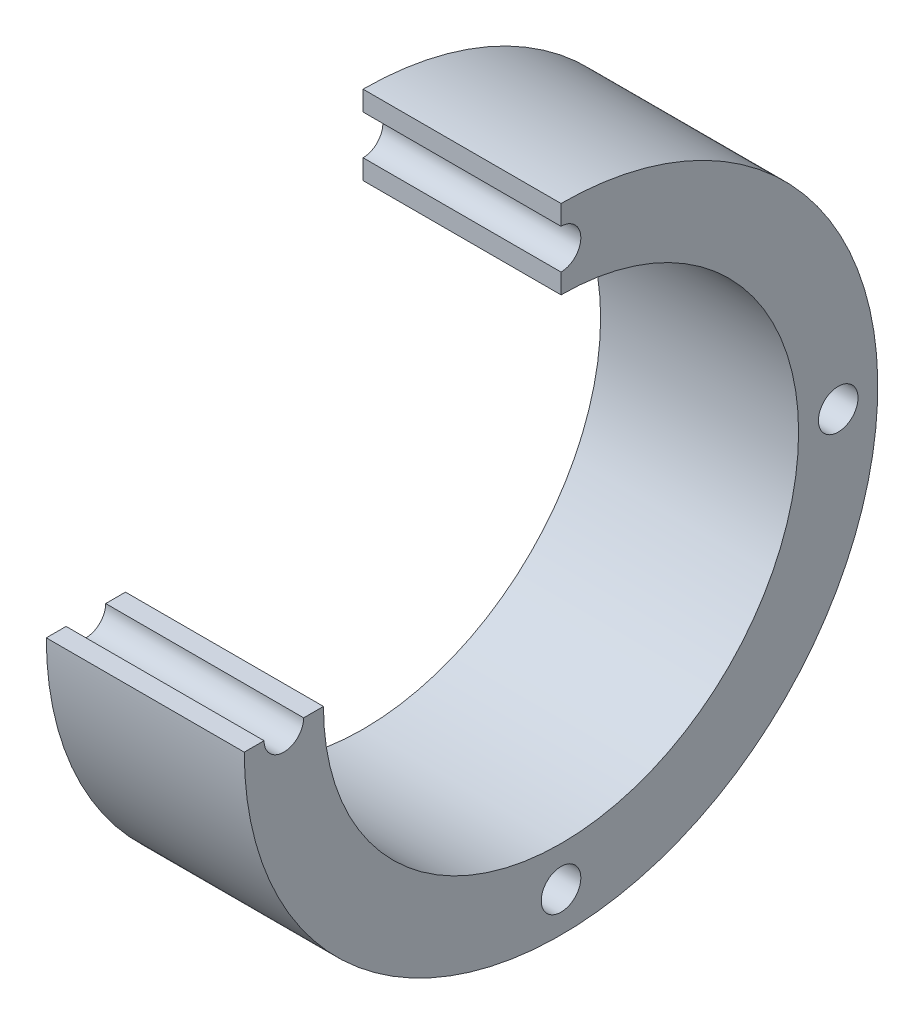
ISO-10303-21;
HEADER;
FILE_DESCRIPTION(('STEP AP214'),'2;1');
FILE_NAME('part.step','',(''),(''),'','','');
FILE_SCHEMA(('AUTOMOTIVE_DESIGN { 1 0 10303 214 1 1 1 1 }'));
ENDSEC;
DATA;
#1=APPLICATION_CONTEXT('core data for automotive mechanical design processes');
#2=APPLICATION_PROTOCOL_DEFINITION('international standard','automotive_design',2000,#1);
#3=PRODUCT_CONTEXT('',#1,'mechanical');
#4=PRODUCT('Part','Part','',(#3));
#5=PRODUCT_RELATED_PRODUCT_CATEGORY('part','',(#4));
#6=PRODUCT_DEFINITION_FORMATION('','',#4);
#7=PRODUCT_DEFINITION_CONTEXT('part definition',#1,'design');
#8=PRODUCT_DEFINITION('design','',#6,#7);
#9=PRODUCT_DEFINITION_SHAPE('','',#8);
#10=(LENGTH_UNIT() NAMED_UNIT(*) SI_UNIT(.MILLI.,.METRE.));
#11=(NAMED_UNIT(*) PLANE_ANGLE_UNIT() SI_UNIT($,.RADIAN.));
#12=(NAMED_UNIT(*) SI_UNIT($,.STERADIAN.) SOLID_ANGLE_UNIT());
#13=UNCERTAINTY_MEASURE_WITH_UNIT(LENGTH_MEASURE(1.E-05),#10,'distance_accuracy_value','');
#14=(GEOMETRIC_REPRESENTATION_CONTEXT(3) GLOBAL_UNCERTAINTY_ASSIGNED_CONTEXT((#13)) GLOBAL_UNIT_ASSIGNED_CONTEXT((#10,
#11,#12)) REPRESENTATION_CONTEXT('',''));
#15=CARTESIAN_POINT('',(0.,0.,0.));
#16=DIRECTION('',(0.,0.,1.));
#17=DIRECTION('',(1.,0.,0.));
#18=AXIS2_PLACEMENT_3D('',#15,#16,#17);
#19=CARTESIAN_POINT('',(25.,0.,0.));
#20=DIRECTION('',(1.,0.,0.));
#21=DIRECTION('',(0.,0.,-1.));
#22=AXIS2_PLACEMENT_3D('',#19,#20,#21);
#23=PLANE('',#22);
#24=DIRECTION('',(0.,0.,-1.));
#25=VECTOR('',#24,1.);
#26=CARTESIAN_POINT('',(25.,0.,93.474358870609));
#27=LINE('',#26,#25);
#28=CARTESIAN_POINT('',(25.,0.,80.));
#29=VERTEX_POINT('',#28);
#30=CARTESIAN_POINT('',(25.,0.,75.));
#31=VERTEX_POINT('',#30);
#32=EDGE_CURVE('E57',#29,#31,#27,.T.);
#33=ORIENTED_EDGE('',*,*,#32,.F.);
#34=CARTESIAN_POINT('',(25.,0.,0.));
#35=DIRECTION('',(1.,0.,0.));
#36=DIRECTION('',(0.,0.,-1.));
#37=AXIS2_PLACEMENT_3D('',#34,#35,#36);
#38=CIRCLE('',#37,80.);
#39=CARTESIAN_POINT('',(25.,80.,0.));
#40=VERTEX_POINT('',#39);
#41=EDGE_CURVE('E116',#29,#40,#38,.T.);
#42=ORIENTED_EDGE('',*,*,#41,.T.);
#43=DIRECTION('',(0.,1.,0.));
#44=VECTOR('',#43,1.);
#45=CARTESIAN_POINT('',(25.,0.,0.));
#46=LINE('',#45,#44);
#47=CARTESIAN_POINT('',(25.,75.,0.));
#48=VERTEX_POINT('',#47);
#49=EDGE_CURVE('E125',#48,#40,#46,.T.);
#50=ORIENTED_EDGE('',*,*,#49,.F.);
#51=CARTESIAN_POINT('',(25.,70.,0.));
#52=DIRECTION('',(1.,0.,0.));
#53=DIRECTION('',(0.,0.,1.));
#54=AXIS2_PLACEMENT_3D('',#51,#52,#53);
#55=CIRCLE('',#54,5.);
#56=CARTESIAN_POINT('',(25.,65.,0.));
#57=VERTEX_POINT('',#56);
#58=EDGE_CURVE('E172',#57,#48,#55,.T.);
#59=ORIENTED_EDGE('',*,*,#58,.F.);
#60=CARTESIAN_POINT('',(25.,60.,0.));
#61=VERTEX_POINT('',#60);
#62=EDGE_CURVE('E152',#61,#57,#46,.T.);
#63=ORIENTED_EDGE('',*,*,#62,.F.);
#64=CARTESIAN_POINT('',(25.,0.,0.));
#65=DIRECTION('',(1.,0.,0.));
#66=DIRECTION('',(0.,0.,-1.));
#67=AXIS2_PLACEMENT_3D('',#64,#65,#66);
#68=CIRCLE('',#67,60.);
#69=CARTESIAN_POINT('',(25.,0.,60.));
#70=VERTEX_POINT('',#69);
#71=EDGE_CURVE('E134',#70,#61,#68,.T.);
#72=ORIENTED_EDGE('',*,*,#71,.F.);
#73=CARTESIAN_POINT('',(25.,0.,65.));
#74=VERTEX_POINT('',#73);
#75=EDGE_CURVE('E122',#74,#70,#27,.T.);
#76=ORIENTED_EDGE('',*,*,#75,.F.);
#77=CARTESIAN_POINT('',(25.,-7.33211081157058E-13,70.));
#78=DIRECTION('',(1.,0.,0.));
#79=DIRECTION('',(0.,-1.,0.));
#80=AXIS2_PLACEMENT_3D('',#77,#78,#79);
#81=CIRCLE('',#80,5.);
#82=EDGE_CURVE('E112',#31,#74,#81,.T.);
#83=ORIENTED_EDGE('',*,*,#82,.F.);
#84=EDGE_LOOP('',(#33,#42,#50,#59,#63,#72,#76,#83));
#85=FACE_BOUND('',#84,.T.);
#86=CARTESIAN_POINT('',(25.,2.44403693719019E-13,-70.));
#87=DIRECTION('',(1.,0.,0.));
#88=DIRECTION('',(0.,1.,0.));
#89=AXIS2_PLACEMENT_3D('',#86,#87,#88);
#90=CIRCLE('',#89,5.);
#91=CARTESIAN_POINT('',(25.,5.00000000000025,-70.));
#92=VERTEX_POINT('',#91);
#93=EDGE_CURVE('E164',#92,#92,#90,.T.);
#94=ORIENTED_EDGE('',*,*,#93,.F.);
#95=EDGE_LOOP('',(#94));
#96=FACE_BOUND('',#95,.T.);
#97=CARTESIAN_POINT('',(25.,-70.,0.));
#98=DIRECTION('',(1.,0.,0.));
#99=DIRECTION('',(0.,0.,-1.));
#100=AXIS2_PLACEMENT_3D('',#97,#98,#99);
#101=CIRCLE('',#100,5.);
#102=CARTESIAN_POINT('',(25.,-70.,-5.));
#103=VERTEX_POINT('',#102);
#104=EDGE_CURVE('E163',#103,#103,#101,.T.);
#105=ORIENTED_EDGE('',*,*,#104,.F.);
#106=EDGE_LOOP('',(#105));
#107=FACE_BOUND('',#106,.T.);
#108=ADVANCED_FACE('F41',(#85,#96,#107),#23,.T.);
#109=CARTESIAN_POINT('',(-25.,0.,0.));
#110=DIRECTION('',(1.,0.,0.));
#111=DIRECTION('',(0.,0.,-1.));
#112=AXIS2_PLACEMENT_3D('',#109,#110,#111);
#113=PLANE('',#112);
#114=CARTESIAN_POINT('',(-25.,2.44403693719019E-13,-70.));
#115=DIRECTION('',(1.,0.,0.));
#116=DIRECTION('',(0.,1.,0.));
#117=AXIS2_PLACEMENT_3D('',#114,#115,#116);
#118=CIRCLE('',#117,5.);
#119=CARTESIAN_POINT('',(-25.,5.00000000000025,-70.));
#120=VERTEX_POINT('',#119);
#121=EDGE_CURVE('E161',#120,#120,#118,.T.);
#122=ORIENTED_EDGE('',*,*,#121,.T.);
#123=EDGE_LOOP('',(#122));
#124=FACE_BOUND('',#123,.T.);
#125=CARTESIAN_POINT('',(-25.,0.,0.));
#126=DIRECTION('',(1.,0.,0.));
#127=DIRECTION('',(0.,0.,-1.));
#128=AXIS2_PLACEMENT_3D('',#125,#126,#127);
#129=CIRCLE('',#128,60.);
#130=CARTESIAN_POINT('',(-25.,0.,60.));
#131=VERTEX_POINT('',#130);
#132=CARTESIAN_POINT('',(-25.,60.,0.));
#133=VERTEX_POINT('',#132);
#134=EDGE_CURVE('E136',#131,#133,#129,.T.);
#135=ORIENTED_EDGE('',*,*,#134,.T.);
#136=DIRECTION('',(0.,1.,0.));
#137=VECTOR('',#136,1.);
#138=CARTESIAN_POINT('',(-25.,0.,0.));
#139=LINE('',#138,#137);
#140=CARTESIAN_POINT('',(-25.,65.,0.));
#141=VERTEX_POINT('',#140);
#142=EDGE_CURVE('E155',#133,#141,#139,.T.);
#143=ORIENTED_EDGE('',*,*,#142,.T.);
#144=CARTESIAN_POINT('',(-25.,70.,0.));
#145=DIRECTION('',(1.,0.,0.));
#146=DIRECTION('',(0.,0.,1.));
#147=AXIS2_PLACEMENT_3D('',#144,#145,#146);
#148=CIRCLE('',#147,5.);
#149=CARTESIAN_POINT('',(-25.,75.,0.));
#150=VERTEX_POINT('',#149);
#151=EDGE_CURVE('E169',#141,#150,#148,.T.);
#152=ORIENTED_EDGE('',*,*,#151,.T.);
#153=CARTESIAN_POINT('',(-25.,80.,0.));
#154=VERTEX_POINT('',#153);
#155=EDGE_CURVE('E147',#150,#154,#139,.T.);
#156=ORIENTED_EDGE('',*,*,#155,.T.);
#157=CARTESIAN_POINT('',(-25.,0.,0.));
#158=DIRECTION('',(1.,0.,0.));
#159=DIRECTION('',(0.,0.,-1.));
#160=AXIS2_PLACEMENT_3D('',#157,#158,#159);
#161=CIRCLE('',#160,80.);
#162=CARTESIAN_POINT('',(-25.,0.,80.));
#163=VERTEX_POINT('',#162);
#164=EDGE_CURVE('E126',#163,#154,#161,.T.);
#165=ORIENTED_EDGE('',*,*,#164,.F.);
#166=DIRECTION('',(0.,0.,-1.));
#167=VECTOR('',#166,1.);
#168=CARTESIAN_POINT('',(-25.,0.,93.474358870609));
#169=LINE('',#168,#167);
#170=CARTESIAN_POINT('',(-25.,0.,75.));
#171=VERTEX_POINT('',#170);
#172=EDGE_CURVE('E106',#163,#171,#169,.T.);
#173=ORIENTED_EDGE('',*,*,#172,.T.);
#174=CARTESIAN_POINT('',(-25.,-7.33211081157058E-13,70.));
#175=DIRECTION('',(1.,0.,0.));
#176=DIRECTION('',(0.,-1.,0.));
#177=AXIS2_PLACEMENT_3D('',#174,#175,#176);
#178=CIRCLE('',#177,5.);
#179=CARTESIAN_POINT('',(-25.,-7.33211081157058E-13,65.));
#180=VERTEX_POINT('',#179);
#181=EDGE_CURVE('E145',#171,#180,#178,.T.);
#182=ORIENTED_EDGE('',*,*,#181,.T.);
#183=EDGE_CURVE('E61',#180,#131,#169,.T.);
#184=ORIENTED_EDGE('',*,*,#183,.T.);
#185=EDGE_LOOP('',(#135,#143,#152,#156,#165,#173,#182,#184));
#186=FACE_BOUND('',#185,.T.);
#187=CARTESIAN_POINT('',(-25.,-70.,0.));
#188=DIRECTION('',(1.,0.,0.));
#189=DIRECTION('',(0.,0.,-1.));
#190=AXIS2_PLACEMENT_3D('',#187,#188,#189);
#191=CIRCLE('',#190,5.);
#192=CARTESIAN_POINT('',(-25.,-70.,-5.));
#193=VERTEX_POINT('',#192);
#194=EDGE_CURVE('E176',#193,#193,#191,.T.);
#195=ORIENTED_EDGE('',*,*,#194,.T.);
#196=EDGE_LOOP('',(#195));
#197=FACE_BOUND('',#196,.T.);
#198=ADVANCED_FACE('F150',(#124,#186,#197),#113,.F.);
#199=CARTESIAN_POINT('',(25.,0.,0.));
#200=DIRECTION('',(-1.,0.,0.));
#201=DIRECTION('',(0.,0.,1.));
#202=AXIS2_PLACEMENT_3D('',#199,#200,#201);
#203=CYLINDRICAL_SURFACE('',#202,80.);
#204=ORIENTED_EDGE('',*,*,#164,.T.);
#205=DIRECTION('',(-1.,0.,0.));
#206=VECTOR('',#205,1.);
#207=CARTESIAN_POINT('',(25.,80.,0.));
#208=LINE('',#207,#206);
#209=EDGE_CURVE('E127',#154,#40,#208,.F.);
#210=ORIENTED_EDGE('',*,*,#209,.T.);
#211=ORIENTED_EDGE('',*,*,#41,.F.);
#212=DIRECTION('',(-1.,0.,0.));
#213=VECTOR('',#212,1.);
#214=CARTESIAN_POINT('',(25.,0.,80.));
#215=LINE('',#214,#213);
#216=EDGE_CURVE('E103',#29,#163,#215,.T.);
#217=ORIENTED_EDGE('',*,*,#216,.T.);
#218=EDGE_LOOP('',(#204,#210,#211,#217));
#219=FACE_BOUND('',#218,.T.);
#220=ADVANCED_FACE('F43',(#219),#203,.T.);
#221=CARTESIAN_POINT('',(25.,0.,0.));
#222=DIRECTION('',(-1.,0.,0.));
#223=DIRECTION('',(0.,0.,1.));
#224=AXIS2_PLACEMENT_3D('',#221,#222,#223);
#225=CYLINDRICAL_SURFACE('',#224,60.);
#226=DIRECTION('',(-1.,0.,0.));
#227=VECTOR('',#226,1.);
#228=CARTESIAN_POINT('',(25.,60.,0.));
#229=LINE('',#228,#227);
#230=EDGE_CURVE('E160',#133,#61,#229,.F.);
#231=ORIENTED_EDGE('',*,*,#230,.F.);
#232=ORIENTED_EDGE('',*,*,#134,.F.);
#233=DIRECTION('',(-1.,0.,0.));
#234=VECTOR('',#233,1.);
#235=CARTESIAN_POINT('',(25.,0.,60.));
#236=LINE('',#235,#234);
#237=EDGE_CURVE('E115',#70,#131,#236,.T.);
#238=ORIENTED_EDGE('',*,*,#237,.F.);
#239=ORIENTED_EDGE('',*,*,#71,.T.);
#240=EDGE_LOOP('',(#231,#232,#238,#239));
#241=FACE_BOUND('',#240,.T.);
#242=ADVANCED_FACE('F189',(#241),#225,.F.);
#243=CARTESIAN_POINT('',(-25.,-70.,0.));
#244=DIRECTION('',(1.,0.,0.));
#245=DIRECTION('',(0.,0.,-1.));
#246=AXIS2_PLACEMENT_3D('',#243,#244,#245);
#247=CYLINDRICAL_SURFACE('',#246,5.);
#248=ORIENTED_EDGE('',*,*,#194,.F.);
#249=EDGE_LOOP('',(#248));
#250=FACE_BOUND('',#249,.T.);
#251=ORIENTED_EDGE('',*,*,#104,.T.);
#252=EDGE_LOOP('',(#251));
#253=FACE_BOUND('',#252,.T.);
#254=ADVANCED_FACE('F216',(#250,#253),#247,.F.);
#255=CARTESIAN_POINT('',(-25.,-7.33211081157058E-13,70.));
#256=DIRECTION('',(1.,0.,0.));
#257=DIRECTION('',(0.,0.,-1.));
#258=AXIS2_PLACEMENT_3D('',#255,#256,#257);
#259=CYLINDRICAL_SURFACE('',#258,5.);
#260=ORIENTED_EDGE('',*,*,#82,.T.);
#261=DIRECTION('',(1.,0.,0.));
#262=VECTOR('',#261,1.);
#263=CARTESIAN_POINT('',(-25.,0.,65.));
#264=LINE('',#263,#262);
#265=EDGE_CURVE('E11',#74,#180,#264,.F.);
#266=ORIENTED_EDGE('',*,*,#265,.T.);
#267=ORIENTED_EDGE('',*,*,#181,.F.);
#268=DIRECTION('',(1.,0.,0.));
#269=VECTOR('',#268,1.);
#270=CARTESIAN_POINT('',(-25.,0.,75.));
#271=LINE('',#270,#269);
#272=EDGE_CURVE('E47',#171,#31,#271,.T.);
#273=ORIENTED_EDGE('',*,*,#272,.T.);
#274=EDGE_LOOP('',(#260,#266,#267,#273));
#275=FACE_BOUND('',#274,.T.);
#276=ADVANCED_FACE('F142',(#275),#259,.F.);
#277=CARTESIAN_POINT('',(-25.,70.,0.));
#278=DIRECTION('',(1.,0.,0.));
#279=DIRECTION('',(0.,0.,-1.));
#280=AXIS2_PLACEMENT_3D('',#277,#278,#279);
#281=CYLINDRICAL_SURFACE('',#280,5.);
#282=ORIENTED_EDGE('',*,*,#58,.T.);
#283=DIRECTION('',(1.,0.,0.));
#284=VECTOR('',#283,1.);
#285=CARTESIAN_POINT('',(-25.,75.,0.));
#286=LINE('',#285,#284);
#287=EDGE_CURVE('E132',#48,#150,#286,.F.);
#288=ORIENTED_EDGE('',*,*,#287,.T.);
#289=ORIENTED_EDGE('',*,*,#151,.F.);
#290=DIRECTION('',(1.,0.,0.));
#291=VECTOR('',#290,1.);
#292=CARTESIAN_POINT('',(-25.,65.,0.));
#293=LINE('',#292,#291);
#294=EDGE_CURVE('E130',#141,#57,#293,.T.);
#295=ORIENTED_EDGE('',*,*,#294,.T.);
#296=EDGE_LOOP('',(#282,#288,#289,#295));
#297=FACE_BOUND('',#296,.T.);
#298=ADVANCED_FACE('F193',(#297),#281,.F.);
#299=CARTESIAN_POINT('',(-25.,2.44403693719019E-13,-70.));
#300=DIRECTION('',(1.,0.,0.));
#301=DIRECTION('',(0.,0.,-1.));
#302=AXIS2_PLACEMENT_3D('',#299,#300,#301);
#303=CYLINDRICAL_SURFACE('',#302,5.);
#304=ORIENTED_EDGE('',*,*,#121,.F.);
#305=EDGE_LOOP('',(#304));
#306=FACE_BOUND('',#305,.T.);
#307=ORIENTED_EDGE('',*,*,#93,.T.);
#308=EDGE_LOOP('',(#307));
#309=FACE_BOUND('',#308,.T.);
#310=ADVANCED_FACE('F202',(#306,#309),#303,.F.);
#311=CARTESIAN_POINT('',(-25.,0.,0.));
#312=DIRECTION('',(0.,0.,-1.));
#313=DIRECTION('',(-1.,0.,0.));
#314=AXIS2_PLACEMENT_3D('',#311,#312,#313);
#315=PLANE('',#314);
#316=ORIENTED_EDGE('',*,*,#230,.T.);
#317=ORIENTED_EDGE('',*,*,#62,.T.);
#318=ORIENTED_EDGE('',*,*,#294,.F.);
#319=ORIENTED_EDGE('',*,*,#142,.F.);
#320=EDGE_LOOP('',(#316,#317,#318,#319));
#321=FACE_BOUND('',#320,.T.);
#322=ADVANCED_FACE('F191',(#321),#315,.F.);
#323=ORIENTED_EDGE('',*,*,#155,.F.);
#324=ORIENTED_EDGE('',*,*,#287,.F.);
#325=ORIENTED_EDGE('',*,*,#49,.T.);
#326=ORIENTED_EDGE('',*,*,#209,.F.);
#327=EDGE_LOOP('',(#323,#324,#325,#326));
#328=FACE_BOUND('',#327,.T.);
#329=ADVANCED_FACE('F198',(#328),#315,.F.);
#330=CARTESIAN_POINT('',(-25.,0.,93.474358870609));
#331=DIRECTION('',(0.,-1.,0.));
#332=DIRECTION('',(0.,0.,-1.));
#333=AXIS2_PLACEMENT_3D('',#330,#331,#332);
#334=PLANE('',#333);
#335=ORIENTED_EDGE('',*,*,#32,.T.);
#336=ORIENTED_EDGE('',*,*,#272,.F.);
#337=ORIENTED_EDGE('',*,*,#172,.F.);
#338=ORIENTED_EDGE('',*,*,#216,.F.);
#339=EDGE_LOOP('',(#335,#336,#337,#338));
#340=FACE_BOUND('',#339,.T.);
#341=ADVANCED_FACE('F102',(#340),#334,.F.);
#342=ORIENTED_EDGE('',*,*,#237,.T.);
#343=ORIENTED_EDGE('',*,*,#183,.F.);
#344=ORIENTED_EDGE('',*,*,#265,.F.);
#345=ORIENTED_EDGE('',*,*,#75,.T.);
#346=EDGE_LOOP('',(#342,#343,#344,#345));
#347=FACE_BOUND('',#346,.T.);
#348=ADVANCED_FACE('F201',(#347),#334,.F.);
#349=CLOSED_SHELL('',(#108,#198,#220,#242,#254,#276,#298,#310,#322,#329,#341,#348));
#350=MANIFOLD_SOLID_BREP('B2',#349);
#351=ADVANCED_BREP_SHAPE_REPRESENTATION('',(#18,#350),#14);
#352=SHAPE_DEFINITION_REPRESENTATION(#9,#351);
ENDSEC;
END-ISO-10303-21;
